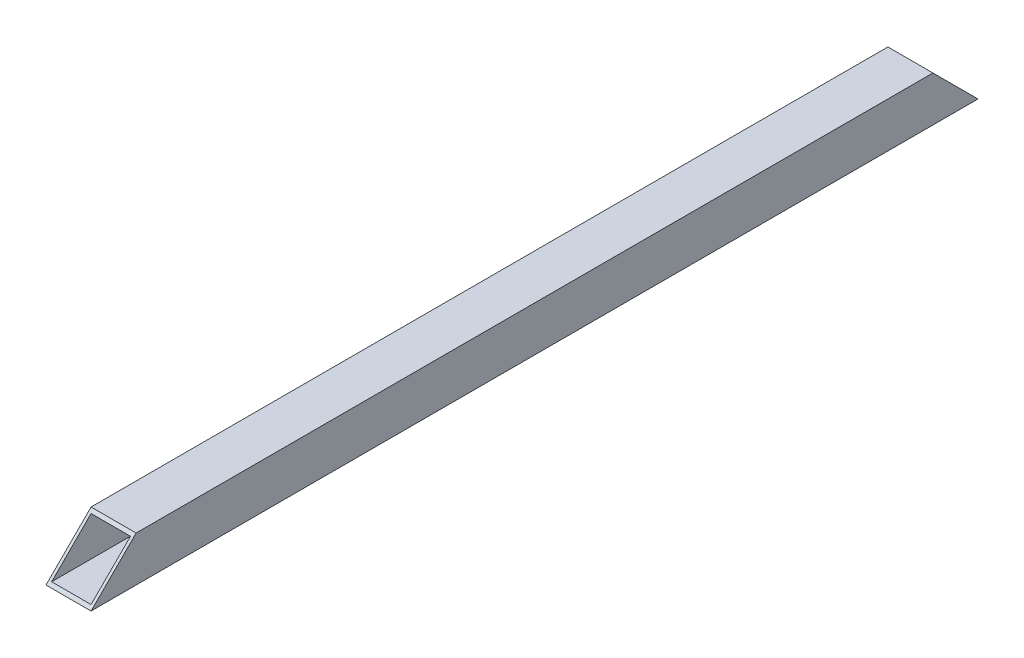
ISO-10303-21;
HEADER;
FILE_DESCRIPTION(('STEP AP214'),'2;1');
FILE_NAME('part.step','',(''),(''),'','','');
FILE_SCHEMA(('AUTOMOTIVE_DESIGN { 1 0 10303 214 1 1 1 1 }'));
ENDSEC;
DATA;
#1=APPLICATION_CONTEXT('core data for automotive mechanical design processes');
#2=APPLICATION_PROTOCOL_DEFINITION('international standard','automotive_design',2000,#1);
#3=PRODUCT_CONTEXT('',#1,'mechanical');
#4=PRODUCT('Part','Part','',(#3));
#5=PRODUCT_RELATED_PRODUCT_CATEGORY('part','',(#4));
#6=PRODUCT_DEFINITION_FORMATION('','',#4);
#7=PRODUCT_DEFINITION_CONTEXT('part definition',#1,'design');
#8=PRODUCT_DEFINITION('design','',#6,#7);
#9=PRODUCT_DEFINITION_SHAPE('','',#8);
#10=(LENGTH_UNIT() NAMED_UNIT(*) SI_UNIT(.MILLI.,.METRE.));
#11=(NAMED_UNIT(*) PLANE_ANGLE_UNIT() SI_UNIT($,.RADIAN.));
#12=(NAMED_UNIT(*) SI_UNIT($,.STERADIAN.) SOLID_ANGLE_UNIT());
#13=UNCERTAINTY_MEASURE_WITH_UNIT(LENGTH_MEASURE(1.E-05),#10,'distance_accuracy_value','');
#14=(GEOMETRIC_REPRESENTATION_CONTEXT(3) GLOBAL_UNCERTAINTY_ASSIGNED_CONTEXT((#13)) GLOBAL_UNIT_ASSIGNED_CONTEXT((#10,
#11,#12)) REPRESENTATION_CONTEXT('',''));
#15=CARTESIAN_POINT('',(0.,0.,0.));
#16=DIRECTION('',(0.,0.,1.));
#17=DIRECTION('',(1.,0.,0.));
#18=AXIS2_PLACEMENT_3D('',#15,#16,#17);
#19=CARTESIAN_POINT('',(11.1125,11.1125,250.));
#20=DIRECTION('',(0.,-1.,0.));
#21=DIRECTION('',(0.,0.,-1.));
#22=AXIS2_PLACEMENT_3D('',#19,#20,#21);
#23=PLANE('',#22);
#24=DIRECTION('',(1.,0.,0.));
#25=VECTOR('',#24,1.);
#26=CARTESIAN_POINT('',(11.1125,11.1125,226.1875));
#27=LINE('',#26,#25);
#28=CARTESIAN_POINT('',(-11.1125,11.1125,226.1875));
#29=VERTEX_POINT('',#28);
#30=CARTESIAN_POINT('',(11.1125,11.1125,226.1875));
#31=VERTEX_POINT('',#30);
#32=EDGE_CURVE('E11',#29,#31,#27,.T.);
#33=ORIENTED_EDGE('',*,*,#32,.F.);
#34=DIRECTION('',(0.,0.,-1.));
#35=VECTOR('',#34,1.);
#36=CARTESIAN_POINT('',(-11.1125,11.1125,250.));
#37=LINE('',#36,#35);
#38=CARTESIAN_POINT('',(-11.1125,11.1125,-226.1875));
#39=VERTEX_POINT('',#38);
#40=EDGE_CURVE('E144',#29,#39,#37,.T.);
#41=ORIENTED_EDGE('',*,*,#40,.T.);
#42=DIRECTION('',(-1.,0.,0.));
#43=VECTOR('',#42,1.);
#44=CARTESIAN_POINT('',(11.1125,11.1125,-226.1875));
#45=LINE('',#44,#43);
#46=CARTESIAN_POINT('',(11.1125,11.1125,-226.1875));
#47=VERTEX_POINT('',#46);
#48=EDGE_CURVE('E44',#47,#39,#45,.T.);
#49=ORIENTED_EDGE('',*,*,#48,.F.);
#50=DIRECTION('',(0.,0.,-1.));
#51=VECTOR('',#50,1.);
#52=CARTESIAN_POINT('',(11.1125,11.1125,250.));
#53=LINE('',#52,#51);
#54=EDGE_CURVE('E151',#31,#47,#53,.T.);
#55=ORIENTED_EDGE('',*,*,#54,.F.);
#56=EDGE_LOOP('',(#33,#41,#49,#55));
#57=FACE_BOUND('',#56,.T.);
#58=ADVANCED_FACE('F36',(#57),#23,.T.);
#59=CARTESIAN_POINT('',(11.1125,-11.1125,250.));
#60=DIRECTION('',(-1.,0.,0.));
#61=DIRECTION('',(0.,-1.,0.));
#62=AXIS2_PLACEMENT_3D('',#59,#60,#61);
#63=PLANE('',#62);
#64=DIRECTION('',(0.,-0.707106781186551,0.707106781186544));
#65=VECTOR('',#64,1.);
#66=CARTESIAN_POINT('',(11.1125,-11.90625,249.20625));
#67=LINE('',#66,#65);
#68=CARTESIAN_POINT('',(11.1125,-11.1125,248.4125));
#69=VERTEX_POINT('',#68);
#70=EDGE_CURVE('E147',#31,#69,#67,.T.);
#71=ORIENTED_EDGE('',*,*,#70,.F.);
#72=ORIENTED_EDGE('',*,*,#54,.T.);
#73=DIRECTION('',(0.,0.707106781186551,0.707106781186544));
#74=VECTOR('',#73,1.);
#75=CARTESIAN_POINT('',(11.1125,238.09375,0.793749999997373));
#76=LINE('',#75,#74);
#77=CARTESIAN_POINT('',(11.1125,-11.1125,-248.4125));
#78=VERTEX_POINT('',#77);
#79=EDGE_CURVE('E106',#78,#47,#76,.T.);
#80=ORIENTED_EDGE('',*,*,#79,.F.);
#81=DIRECTION('',(0.,0.,-1.));
#82=VECTOR('',#81,1.);
#83=CARTESIAN_POINT('',(11.1125,-11.1125,250.));
#84=LINE('',#83,#82);
#85=EDGE_CURVE('E154',#69,#78,#84,.T.);
#86=ORIENTED_EDGE('',*,*,#85,.F.);
#87=EDGE_LOOP('',(#71,#72,#80,#86));
#88=FACE_BOUND('',#87,.T.);
#89=ADVANCED_FACE('F184',(#88),#63,.T.);
#90=CARTESIAN_POINT('',(11.1125,-11.1125,250.));
#91=DIRECTION('',(0.,1.,0.));
#92=DIRECTION('',(0.,0.,1.));
#93=AXIS2_PLACEMENT_3D('',#90,#91,#92);
#94=PLANE('',#93);
#95=DIRECTION('',(-1.,0.,0.));
#96=VECTOR('',#95,1.);
#97=CARTESIAN_POINT('',(11.1125,-11.1125,248.4125));
#98=LINE('',#97,#96);
#99=CARTESIAN_POINT('',(-11.1125,-11.1125,248.4125));
#100=VERTEX_POINT('',#99);
#101=EDGE_CURVE('E156',#69,#100,#98,.T.);
#102=ORIENTED_EDGE('',*,*,#101,.F.);
#103=ORIENTED_EDGE('',*,*,#85,.T.);
#104=DIRECTION('',(1.,0.,0.));
#105=VECTOR('',#104,1.);
#106=CARTESIAN_POINT('',(11.1125,-11.1125,-248.4125));
#107=LINE('',#106,#105);
#108=CARTESIAN_POINT('',(-11.1125,-11.1125,-248.4125));
#109=VERTEX_POINT('',#108);
#110=EDGE_CURVE('E148',#109,#78,#107,.T.);
#111=ORIENTED_EDGE('',*,*,#110,.F.);
#112=DIRECTION('',(0.,0.,-1.));
#113=VECTOR('',#112,1.);
#114=CARTESIAN_POINT('',(-11.1125,-11.1125,250.));
#115=LINE('',#114,#113);
#116=EDGE_CURVE('E146',#100,#109,#115,.T.);
#117=ORIENTED_EDGE('',*,*,#116,.F.);
#118=EDGE_LOOP('',(#102,#103,#111,#117));
#119=FACE_BOUND('',#118,.T.);
#120=ADVANCED_FACE('F182',(#119),#94,.T.);
#121=CARTESIAN_POINT('',(-11.1125,-11.1125,250.));
#122=DIRECTION('',(1.,0.,0.));
#123=DIRECTION('',(0.,0.,-1.));
#124=AXIS2_PLACEMENT_3D('',#121,#122,#123);
#125=PLANE('',#124);
#126=DIRECTION('',(0.,0.707106781186551,-0.707106781186544));
#127=VECTOR('',#126,1.);
#128=CARTESIAN_POINT('',(-11.1125,-11.90625,249.20625));
#129=LINE('',#128,#127);
#130=EDGE_CURVE('E152',#100,#29,#129,.T.);
#131=ORIENTED_EDGE('',*,*,#130,.F.);
#132=ORIENTED_EDGE('',*,*,#116,.T.);
#133=DIRECTION('',(0.,-0.707106781186551,-0.707106781186544));
#134=VECTOR('',#133,1.);
#135=CARTESIAN_POINT('',(-11.1125,238.09375,0.793749999997373));
#136=LINE('',#135,#134);
#137=EDGE_CURVE('E132',#39,#109,#136,.T.);
#138=ORIENTED_EDGE('',*,*,#137,.F.);
#139=ORIENTED_EDGE('',*,*,#40,.F.);
#140=EDGE_LOOP('',(#131,#132,#138,#139));
#141=FACE_BOUND('',#140,.T.);
#142=ADVANCED_FACE('F143',(#141),#125,.T.);
#143=CARTESIAN_POINT('',(-12.7,12.7,-224.6));
#144=DIRECTION('',(0.,-0.707106781186544,0.707106781186551));
#145=DIRECTION('',(0.,-0.707106781186551,-0.707106781186544));
#146=AXIS2_PLACEMENT_3D('',#143,#144,#145);
#147=PLANE('',#146);
#148=ORIENTED_EDGE('',*,*,#137,.T.);
#149=ORIENTED_EDGE('',*,*,#110,.T.);
#150=ORIENTED_EDGE('',*,*,#79,.T.);
#151=ORIENTED_EDGE('',*,*,#48,.T.);
#152=EDGE_LOOP('',(#148,#149,#150,#151));
#153=FACE_BOUND('',#152,.T.);
#154=DIRECTION('',(0.,-0.707106781186551,-0.707106781186544));
#155=VECTOR('',#154,1.);
#156=CARTESIAN_POINT('',(12.7,12.7,-224.6));
#157=LINE('',#156,#155);
#158=CARTESIAN_POINT('',(12.7,12.7,-224.6));
#159=VERTEX_POINT('',#158);
#160=CARTESIAN_POINT('',(12.7,-12.7,-250.));
#161=VERTEX_POINT('',#160);
#162=EDGE_CURVE('E169',#159,#161,#157,.T.);
#163=ORIENTED_EDGE('',*,*,#162,.T.);
#164=DIRECTION('',(1.,0.,0.));
#165=VECTOR('',#164,1.);
#166=CARTESIAN_POINT('',(12.7,-12.7,-250.));
#167=LINE('',#166,#165);
#168=CARTESIAN_POINT('',(-12.7,-12.7,-250.));
#169=VERTEX_POINT('',#168);
#170=EDGE_CURVE('E122',#169,#161,#167,.T.);
#171=ORIENTED_EDGE('',*,*,#170,.F.);
#172=DIRECTION('',(0.,-0.707106781186551,-0.707106781186544));
#173=VECTOR('',#172,1.);
#174=CARTESIAN_POINT('',(-12.7,12.7,-224.6));
#175=LINE('',#174,#173);
#176=CARTESIAN_POINT('',(-12.7,12.7,-224.6));
#177=VERTEX_POINT('',#176);
#178=EDGE_CURVE('E59',#177,#169,#175,.T.);
#179=ORIENTED_EDGE('',*,*,#178,.F.);
#180=DIRECTION('',(1.,0.,0.));
#181=VECTOR('',#180,1.);
#182=CARTESIAN_POINT('',(-12.7,12.7,-224.6));
#183=LINE('',#182,#181);
#184=EDGE_CURVE('E116',#177,#159,#183,.T.);
#185=ORIENTED_EDGE('',*,*,#184,.T.);
#186=EDGE_LOOP('',(#163,#171,#179,#185));
#187=FACE_BOUND('',#186,.T.);
#188=ADVANCED_FACE('F131',(#153,#187),#147,.F.);
#189=CARTESIAN_POINT('',(-12.7,12.7,224.6));
#190=DIRECTION('',(0.,-0.707106781186544,-0.707106781186551));
#191=DIRECTION('',(0.,0.707106781186551,-0.707106781186544));
#192=AXIS2_PLACEMENT_3D('',#189,#190,#191);
#193=PLANE('',#192);
#194=ORIENTED_EDGE('',*,*,#130,.T.);
#195=ORIENTED_EDGE('',*,*,#32,.T.);
#196=ORIENTED_EDGE('',*,*,#70,.T.);
#197=ORIENTED_EDGE('',*,*,#101,.T.);
#198=EDGE_LOOP('',(#194,#195,#196,#197));
#199=FACE_BOUND('',#198,.T.);
#200=DIRECTION('',(0.,0.707106781186551,-0.707106781186544));
#201=VECTOR('',#200,1.);
#202=CARTESIAN_POINT('',(12.7,12.7,224.6));
#203=LINE('',#202,#201);
#204=CARTESIAN_POINT('',(12.7,-12.7,250.));
#205=VERTEX_POINT('',#204);
#206=CARTESIAN_POINT('',(12.7,12.7,224.6));
#207=VERTEX_POINT('',#206);
#208=EDGE_CURVE('E51',#205,#207,#203,.T.);
#209=ORIENTED_EDGE('',*,*,#208,.T.);
#210=DIRECTION('',(1.,0.,0.));
#211=VECTOR('',#210,1.);
#212=CARTESIAN_POINT('',(-12.7,12.7,224.6));
#213=LINE('',#212,#211);
#214=CARTESIAN_POINT('',(-12.7,12.7,224.6));
#215=VERTEX_POINT('',#214);
#216=EDGE_CURVE('E97',#215,#207,#213,.T.);
#217=ORIENTED_EDGE('',*,*,#216,.F.);
#218=DIRECTION('',(0.,0.707106781186551,-0.707106781186544));
#219=VECTOR('',#218,1.);
#220=CARTESIAN_POINT('',(-12.7,12.7,224.6));
#221=LINE('',#220,#219);
#222=CARTESIAN_POINT('',(-12.7,-12.7,250.));
#223=VERTEX_POINT('',#222);
#224=EDGE_CURVE('E100',#223,#215,#221,.T.);
#225=ORIENTED_EDGE('',*,*,#224,.F.);
#226=DIRECTION('',(1.,0.,0.));
#227=VECTOR('',#226,1.);
#228=CARTESIAN_POINT('',(12.7,-12.7,250.));
#229=LINE('',#228,#227);
#230=EDGE_CURVE('E118',#223,#205,#229,.T.);
#231=ORIENTED_EDGE('',*,*,#230,.T.);
#232=EDGE_LOOP('',(#209,#217,#225,#231));
#233=FACE_BOUND('',#232,.T.);
#234=ADVANCED_FACE('F99',(#199,#233),#193,.F.);
#235=CARTESIAN_POINT('',(-12.7,-12.7,250.));
#236=DIRECTION('',(1.,0.,0.));
#237=DIRECTION('',(0.,0.,-1.));
#238=AXIS2_PLACEMENT_3D('',#235,#236,#237);
#239=PLANE('',#238);
#240=DIRECTION('',(0.,0.,-1.));
#241=VECTOR('',#240,1.);
#242=CARTESIAN_POINT('',(-12.7,-12.7,250.));
#243=LINE('',#242,#241);
#244=EDGE_CURVE('E113',#223,#169,#243,.T.);
#245=ORIENTED_EDGE('',*,*,#244,.F.);
#246=ORIENTED_EDGE('',*,*,#224,.T.);
#247=DIRECTION('',(0.,0.,-1.));
#248=VECTOR('',#247,1.);
#249=CARTESIAN_POINT('',(-12.7,12.7,250.));
#250=LINE('',#249,#248);
#251=EDGE_CURVE('E111',#215,#177,#250,.T.);
#252=ORIENTED_EDGE('',*,*,#251,.T.);
#253=ORIENTED_EDGE('',*,*,#178,.T.);
#254=EDGE_LOOP('',(#245,#246,#252,#253));
#255=FACE_BOUND('',#254,.T.);
#256=ADVANCED_FACE('F38',(#255),#239,.F.);
#257=CARTESIAN_POINT('',(12.7,-12.7,250.));
#258=DIRECTION('',(0.,1.,0.));
#259=DIRECTION('',(0.,0.,1.));
#260=AXIS2_PLACEMENT_3D('',#257,#258,#259);
#261=PLANE('',#260);
#262=ORIENTED_EDGE('',*,*,#170,.T.);
#263=DIRECTION('',(0.,0.,-1.));
#264=VECTOR('',#263,1.);
#265=CARTESIAN_POINT('',(12.7,-12.7,250.));
#266=LINE('',#265,#264);
#267=EDGE_CURVE('E120',#205,#161,#266,.T.);
#268=ORIENTED_EDGE('',*,*,#267,.F.);
#269=ORIENTED_EDGE('',*,*,#230,.F.);
#270=ORIENTED_EDGE('',*,*,#244,.T.);
#271=EDGE_LOOP('',(#262,#268,#269,#270));
#272=FACE_BOUND('',#271,.T.);
#273=ADVANCED_FACE('F165',(#272),#261,.F.);
#274=CARTESIAN_POINT('',(12.7,-12.7,250.));
#275=DIRECTION('',(-1.,0.,0.));
#276=DIRECTION('',(0.,-1.,0.));
#277=AXIS2_PLACEMENT_3D('',#274,#275,#276);
#278=PLANE('',#277);
#279=DIRECTION('',(0.,0.,-1.));
#280=VECTOR('',#279,1.);
#281=CARTESIAN_POINT('',(12.7,12.7,250.));
#282=LINE('',#281,#280);
#283=EDGE_CURVE('E117',#207,#159,#282,.T.);
#284=ORIENTED_EDGE('',*,*,#283,.F.);
#285=ORIENTED_EDGE('',*,*,#208,.F.);
#286=ORIENTED_EDGE('',*,*,#267,.T.);
#287=ORIENTED_EDGE('',*,*,#162,.F.);
#288=EDGE_LOOP('',(#284,#285,#286,#287));
#289=FACE_BOUND('',#288,.T.);
#290=ADVANCED_FACE('F168',(#289),#278,.F.);
#291=CARTESIAN_POINT('',(12.7,12.7,250.));
#292=DIRECTION('',(0.,-1.,0.));
#293=DIRECTION('',(0.,0.,-1.));
#294=AXIS2_PLACEMENT_3D('',#291,#292,#293);
#295=PLANE('',#294);
#296=ORIENTED_EDGE('',*,*,#251,.F.);
#297=ORIENTED_EDGE('',*,*,#216,.T.);
#298=ORIENTED_EDGE('',*,*,#283,.T.);
#299=ORIENTED_EDGE('',*,*,#184,.F.);
#300=EDGE_LOOP('',(#296,#297,#298,#299));
#301=FACE_BOUND('',#300,.T.);
#302=ADVANCED_FACE('F115',(#301),#295,.F.);
#303=CLOSED_SHELL('',(#58,#89,#120,#142,#188,#234,#256,#273,#290,#302));
#304=MANIFOLD_SOLID_BREP('B2',#303);
#305=ADVANCED_BREP_SHAPE_REPRESENTATION('',(#18,#304),#14);
#306=SHAPE_DEFINITION_REPRESENTATION(#9,#305);
ENDSEC;
END-ISO-10303-21;
